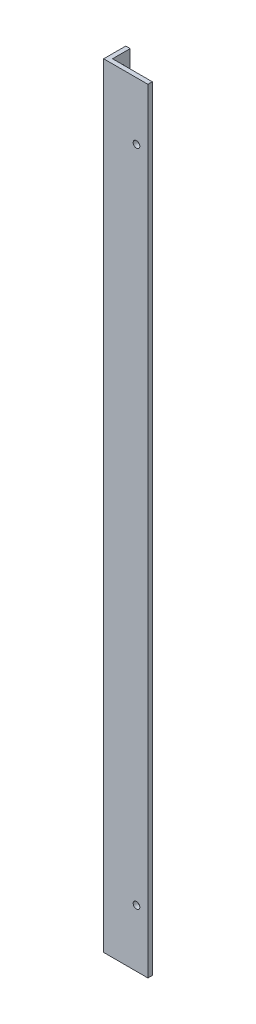
ISO-10303-21;
HEADER;
FILE_DESCRIPTION(('STEP AP214'),'2;1');
FILE_NAME('part.step','',(''),(''),'','','');
FILE_SCHEMA(('AUTOMOTIVE_DESIGN { 1 0 10303 214 1 1 1 1 }'));
ENDSEC;
DATA;
#1=APPLICATION_CONTEXT('core data for automotive mechanical design processes');
#2=APPLICATION_PROTOCOL_DEFINITION('international standard','automotive_design',2000,#1);
#3=PRODUCT_CONTEXT('',#1,'mechanical');
#4=PRODUCT('Part','Part','',(#3));
#5=PRODUCT_RELATED_PRODUCT_CATEGORY('part','',(#4));
#6=PRODUCT_DEFINITION_FORMATION('','',#4);
#7=PRODUCT_DEFINITION_CONTEXT('part definition',#1,'design');
#8=PRODUCT_DEFINITION('design','',#6,#7);
#9=PRODUCT_DEFINITION_SHAPE('','',#8);
#10=(LENGTH_UNIT() NAMED_UNIT(*) SI_UNIT(.MILLI.,.METRE.));
#11=(NAMED_UNIT(*) PLANE_ANGLE_UNIT() SI_UNIT($,.RADIAN.));
#12=(NAMED_UNIT(*) SI_UNIT($,.STERADIAN.) SOLID_ANGLE_UNIT());
#13=UNCERTAINTY_MEASURE_WITH_UNIT(LENGTH_MEASURE(1.E-05),#10,'distance_accuracy_value','');
#14=(GEOMETRIC_REPRESENTATION_CONTEXT(3) GLOBAL_UNCERTAINTY_ASSIGNED_CONTEXT((#13)) GLOBAL_UNIT_ASSIGNED_CONTEXT((#10,
#11,#12)) REPRESENTATION_CONTEXT('',''));
#15=CARTESIAN_POINT('',(0.,0.,0.));
#16=DIRECTION('',(0.,0.,1.));
#17=DIRECTION('',(1.,0.,0.));
#18=AXIS2_PLACEMENT_3D('',#15,#16,#17);
#19=CARTESIAN_POINT('',(0.,0.,0.));
#20=DIRECTION('',(0.,-1.,0.));
#21=DIRECTION('',(0.,0.,-1.));
#22=AXIS2_PLACEMENT_3D('',#19,#20,#21);
#23=PLANE('',#22);
#24=DIRECTION('',(1.,0.,0.));
#25=VECTOR('',#24,1.);
#26=CARTESIAN_POINT('',(20.,0.,0.));
#27=LINE('',#26,#25);
#28=CARTESIAN_POINT('',(0.,0.,0.));
#29=VERTEX_POINT('',#28);
#30=CARTESIAN_POINT('',(20.,0.,0.));
#31=VERTEX_POINT('',#30);
#32=EDGE_CURVE('E101',#29,#31,#27,.T.);
#33=ORIENTED_EDGE('',*,*,#32,.F.);
#34=DIRECTION('',(0.,0.,1.));
#35=VECTOR('',#34,1.);
#36=CARTESIAN_POINT('',(0.,0.,0.));
#37=LINE('',#36,#35);
#38=CARTESIAN_POINT('',(0.,0.,-10.));
#39=VERTEX_POINT('',#38);
#40=EDGE_CURVE('E123',#39,#29,#37,.T.);
#41=ORIENTED_EDGE('',*,*,#40,.F.);
#42=DIRECTION('',(-1.,0.,0.));
#43=VECTOR('',#42,1.);
#44=CARTESIAN_POINT('',(0.,0.,-10.));
#45=LINE('',#44,#43);
#46=CARTESIAN_POINT('',(2.,0.,-10.));
#47=VERTEX_POINT('',#46);
#48=EDGE_CURVE('E120',#47,#39,#45,.T.);
#49=ORIENTED_EDGE('',*,*,#48,.F.);
#50=DIRECTION('',(0.,0.,-1.));
#51=VECTOR('',#50,1.);
#52=CARTESIAN_POINT('',(2.,0.,-10.));
#53=LINE('',#52,#51);
#54=CARTESIAN_POINT('',(2.,0.,-2.));
#55=VERTEX_POINT('',#54);
#56=EDGE_CURVE('E117',#55,#47,#53,.T.);
#57=ORIENTED_EDGE('',*,*,#56,.F.);
#58=DIRECTION('',(-1.,0.,0.));
#59=VECTOR('',#58,1.);
#60=CARTESIAN_POINT('',(2.,0.,-2.));
#61=LINE('',#60,#59);
#62=CARTESIAN_POINT('',(20.,0.,-2.));
#63=VERTEX_POINT('',#62);
#64=EDGE_CURVE('E104',#63,#55,#61,.T.);
#65=ORIENTED_EDGE('',*,*,#64,.F.);
#66=DIRECTION('',(0.,0.,-1.));
#67=VECTOR('',#66,1.);
#68=CARTESIAN_POINT('',(20.,0.,-2.));
#69=LINE('',#68,#67);
#70=EDGE_CURVE('E91',#31,#63,#69,.T.);
#71=ORIENTED_EDGE('',*,*,#70,.F.);
#72=EDGE_LOOP('',(#33,#41,#49,#57,#65,#71));
#73=FACE_BOUND('',#72,.T.);
#74=ADVANCED_FACE('F35',(#73),#23,.T.);
#75=CARTESIAN_POINT('',(0.,372.360679774998,0.));
#76=DIRECTION('',(1.,0.,0.));
#77=DIRECTION('',(0.,0.,-1.));
#78=AXIS2_PLACEMENT_3D('',#75,#76,#77);
#79=PLANE('',#78);
#80=CARTESIAN_POINT('',(0.,6.00000000000001,-5.99999999999998));
#81=DIRECTION('',(-1.,0.,0.));
#82=DIRECTION('',(0.,0.,1.));
#83=AXIS2_PLACEMENT_3D('',#80,#81,#82);
#84=CIRCLE('',#83,1.49999999999999);
#85=CARTESIAN_POINT('',(0.,6.00000000000001,-4.49999999999999));
#86=VERTEX_POINT('',#85);
#87=EDGE_CURVE('E228',#86,#86,#84,.T.);
#88=ORIENTED_EDGE('',*,*,#87,.F.);
#89=EDGE_LOOP('',(#88));
#90=FACE_BOUND('',#89,.T.);
#91=CARTESIAN_POINT('',(0.,20.,-5.99999999999998));
#92=DIRECTION('',(-1.,0.,0.));
#93=DIRECTION('',(0.,0.,1.));
#94=AXIS2_PLACEMENT_3D('',#91,#92,#93);
#95=CIRCLE('',#94,1.49999999999999);
#96=CARTESIAN_POINT('',(0.,20.,-4.49999999999999));
#97=VERTEX_POINT('',#96);
#98=EDGE_CURVE('E232',#97,#97,#95,.T.);
#99=ORIENTED_EDGE('',*,*,#98,.F.);
#100=EDGE_LOOP('',(#99));
#101=FACE_BOUND('',#100,.T.);
#102=CARTESIAN_POINT('',(0.,330.,-5.99999999999998));
#103=DIRECTION('',(-1.,0.,0.));
#104=DIRECTION('',(0.,0.,1.));
#105=AXIS2_PLACEMENT_3D('',#102,#103,#104);
#106=CIRCLE('',#105,1.5);
#107=CARTESIAN_POINT('',(0.,330.,-4.49999999999998));
#108=VERTEX_POINT('',#107);
#109=EDGE_CURVE('E238',#108,#108,#106,.T.);
#110=ORIENTED_EDGE('',*,*,#109,.F.);
#111=EDGE_LOOP('',(#110));
#112=FACE_BOUND('',#111,.T.);
#113=CARTESIAN_POINT('',(0.,344.,-5.99999999999998));
#114=DIRECTION('',(-1.,0.,0.));
#115=DIRECTION('',(0.,0.,1.));
#116=AXIS2_PLACEMENT_3D('',#113,#114,#115);
#117=CIRCLE('',#116,1.5);
#118=CARTESIAN_POINT('',(0.,344.,-4.49999999999998));
#119=VERTEX_POINT('',#118);
#120=EDGE_CURVE('E148',#119,#119,#117,.T.);
#121=ORIENTED_EDGE('',*,*,#120,.F.);
#122=EDGE_LOOP('',(#121));
#123=FACE_BOUND('',#122,.T.);
#124=DIRECTION('',(0.,-1.,0.));
#125=VECTOR('',#124,1.);
#126=CARTESIAN_POINT('',(0.,372.360679774998,0.));
#127=LINE('',#126,#125);
#128=CARTESIAN_POINT('',(0.,350.,2.22044604925031E-13));
#129=VERTEX_POINT('',#128);
#130=EDGE_CURVE('E107',#129,#29,#127,.T.);
#131=ORIENTED_EDGE('',*,*,#130,.F.);
#132=DIRECTION('',(0.,0.,-1.));
#133=VECTOR('',#132,1.);
#134=CARTESIAN_POINT('',(0.,350.,0.));
#135=LINE('',#134,#133);
#136=CARTESIAN_POINT('',(0.,350.,-10.));
#137=VERTEX_POINT('',#136);
#138=EDGE_CURVE('E95',#129,#137,#135,.T.);
#139=ORIENTED_EDGE('',*,*,#138,.T.);
#140=DIRECTION('',(0.,-1.,0.));
#141=VECTOR('',#140,1.);
#142=CARTESIAN_POINT('',(0.,372.360679774998,-10.));
#143=LINE('',#142,#141);
#144=EDGE_CURVE('E126',#137,#39,#143,.T.);
#145=ORIENTED_EDGE('',*,*,#144,.T.);
#146=ORIENTED_EDGE('',*,*,#40,.T.);
#147=EDGE_LOOP('',(#131,#139,#145,#146));
#148=FACE_BOUND('',#147,.T.);
#149=ADVANCED_FACE('F168',(#90,#101,#112,#123,#148),#79,.F.);
#150=CARTESIAN_POINT('',(0.,372.360679774998,-10.));
#151=DIRECTION('',(0.,0.,1.));
#152=DIRECTION('',(1.,0.,0.));
#153=AXIS2_PLACEMENT_3D('',#150,#151,#152);
#154=PLANE('',#153);
#155=ORIENTED_EDGE('',*,*,#144,.F.);
#156=DIRECTION('',(1.,0.,0.));
#157=VECTOR('',#156,1.);
#158=CARTESIAN_POINT('',(0.,350.,-10.));
#159=LINE('',#158,#157);
#160=CARTESIAN_POINT('',(2.,350.,-10.));
#161=VERTEX_POINT('',#160);
#162=EDGE_CURVE('E134',#137,#161,#159,.T.);
#163=ORIENTED_EDGE('',*,*,#162,.T.);
#164=DIRECTION('',(0.,-1.,0.));
#165=VECTOR('',#164,1.);
#166=CARTESIAN_POINT('',(2.,372.360679774998,-10.));
#167=LINE('',#166,#165);
#168=EDGE_CURVE('E128',#161,#47,#167,.T.);
#169=ORIENTED_EDGE('',*,*,#168,.T.);
#170=ORIENTED_EDGE('',*,*,#48,.T.);
#171=EDGE_LOOP('',(#155,#163,#169,#170));
#172=FACE_BOUND('',#171,.T.);
#173=ADVANCED_FACE('F165',(#172),#154,.F.);
#174=CARTESIAN_POINT('',(2.,372.360679774998,-10.));
#175=DIRECTION('',(-1.,0.,0.));
#176=DIRECTION('',(0.,0.,1.));
#177=AXIS2_PLACEMENT_3D('',#174,#175,#176);
#178=PLANE('',#177);
#179=CARTESIAN_POINT('',(2.,6.00000000000001,-5.99999999999998));
#180=DIRECTION('',(-1.,0.,0.));
#181=DIRECTION('',(0.,0.,1.));
#182=AXIS2_PLACEMENT_3D('',#179,#180,#181);
#183=CIRCLE('',#182,1.49999999999999);
#184=CARTESIAN_POINT('',(2.,6.00000000000001,-4.49999999999998));
#185=VERTEX_POINT('',#184);
#186=EDGE_CURVE('E231',#185,#185,#183,.T.);
#187=ORIENTED_EDGE('',*,*,#186,.T.);
#188=EDGE_LOOP('',(#187));
#189=FACE_BOUND('',#188,.T.);
#190=CARTESIAN_POINT('',(2.,20.,-5.99999999999998));
#191=DIRECTION('',(-1.,0.,0.));
#192=DIRECTION('',(0.,0.,1.));
#193=AXIS2_PLACEMENT_3D('',#190,#191,#192);
#194=CIRCLE('',#193,1.49999999999999);
#195=CARTESIAN_POINT('',(2.,20.,-4.49999999999998));
#196=VERTEX_POINT('',#195);
#197=EDGE_CURVE('E39',#196,#196,#194,.T.);
#198=ORIENTED_EDGE('',*,*,#197,.T.);
#199=EDGE_LOOP('',(#198));
#200=FACE_BOUND('',#199,.T.);
#201=CARTESIAN_POINT('',(2.,330.,-5.99999999999998));
#202=DIRECTION('',(-1.,0.,0.));
#203=DIRECTION('',(0.,0.,1.));
#204=AXIS2_PLACEMENT_3D('',#201,#202,#203);
#205=CIRCLE('',#204,1.5);
#206=CARTESIAN_POINT('',(2.,330.,-4.49999999999998));
#207=VERTEX_POINT('',#206);
#208=EDGE_CURVE('E241',#207,#207,#205,.T.);
#209=ORIENTED_EDGE('',*,*,#208,.T.);
#210=EDGE_LOOP('',(#209));
#211=FACE_BOUND('',#210,.T.);
#212=CARTESIAN_POINT('',(2.,344.,-5.99999999999998));
#213=DIRECTION('',(-1.,0.,0.));
#214=DIRECTION('',(0.,0.,1.));
#215=AXIS2_PLACEMENT_3D('',#212,#213,#214);
#216=CIRCLE('',#215,1.5);
#217=CARTESIAN_POINT('',(2.,344.,-4.49999999999998));
#218=VERTEX_POINT('',#217);
#219=EDGE_CURVE('E143',#218,#218,#216,.T.);
#220=ORIENTED_EDGE('',*,*,#219,.T.);
#221=EDGE_LOOP('',(#220));
#222=FACE_BOUND('',#221,.T.);
#223=ORIENTED_EDGE('',*,*,#168,.F.);
#224=DIRECTION('',(0.,0.,1.));
#225=VECTOR('',#224,1.);
#226=CARTESIAN_POINT('',(2.,350.,-10.));
#227=LINE('',#226,#225);
#228=CARTESIAN_POINT('',(2.,350.,-2.));
#229=VERTEX_POINT('',#228);
#230=EDGE_CURVE('E154',#161,#229,#227,.T.);
#231=ORIENTED_EDGE('',*,*,#230,.T.);
#232=DIRECTION('',(0.,-1.,0.));
#233=VECTOR('',#232,1.);
#234=CARTESIAN_POINT('',(2.,372.360679774998,-2.));
#235=LINE('',#234,#233);
#236=EDGE_CURVE('E130',#229,#55,#235,.T.);
#237=ORIENTED_EDGE('',*,*,#236,.T.);
#238=ORIENTED_EDGE('',*,*,#56,.T.);
#239=EDGE_LOOP('',(#223,#231,#237,#238));
#240=FACE_BOUND('',#239,.T.);
#241=ADVANCED_FACE('F161',(#189,#200,#211,#222,#240),#178,.F.);
#242=CARTESIAN_POINT('',(2.,372.360679774998,-2.));
#243=DIRECTION('',(0.,0.,1.));
#244=DIRECTION('',(1.,0.,0.));
#245=AXIS2_PLACEMENT_3D('',#242,#243,#244);
#246=PLANE('',#245);
#247=CARTESIAN_POINT('',(14.8385011410141,25.9101040693963,-2.));
#248=DIRECTION('',(0.,0.,1.));
#249=DIRECTION('',(1.,0.,0.));
#250=AXIS2_PLACEMENT_3D('',#247,#248,#249);
#251=CIRCLE('',#250,1.49999999999999);
#252=CARTESIAN_POINT('',(16.3385011410141,25.9101040693963,-2.));
#253=VERTEX_POINT('',#252);
#254=EDGE_CURVE('E135',#253,#253,#251,.T.);
#255=ORIENTED_EDGE('',*,*,#254,.T.);
#256=EDGE_LOOP('',(#255));
#257=FACE_BOUND('',#256,.T.);
#258=CARTESIAN_POINT('',(14.8385011410141,323.866264902989,-2.));
#259=DIRECTION('',(0.,0.,1.));
#260=DIRECTION('',(1.,0.,0.));
#261=AXIS2_PLACEMENT_3D('',#258,#259,#260);
#262=CIRCLE('',#261,1.49999999999999);
#263=CARTESIAN_POINT('',(16.3385011410141,323.866264902989,-2.));
#264=VERTEX_POINT('',#263);
#265=EDGE_CURVE('E109',#264,#264,#262,.T.);
#266=ORIENTED_EDGE('',*,*,#265,.T.);
#267=EDGE_LOOP('',(#266));
#268=FACE_BOUND('',#267,.T.);
#269=ORIENTED_EDGE('',*,*,#236,.F.);
#270=DIRECTION('',(1.,0.,0.));
#271=VECTOR('',#270,1.);
#272=CARTESIAN_POINT('',(1.99999999999999,350.,-2.));
#273=LINE('',#272,#271);
#274=CARTESIAN_POINT('',(20.,350.,-2.));
#275=VERTEX_POINT('',#274);
#276=EDGE_CURVE('E56',#229,#275,#273,.T.);
#277=ORIENTED_EDGE('',*,*,#276,.T.);
#278=DIRECTION('',(0.,-1.,0.));
#279=VECTOR('',#278,1.);
#280=CARTESIAN_POINT('',(20.,372.360679774998,-2.));
#281=LINE('',#280,#279);
#282=EDGE_CURVE('E96',#275,#63,#281,.T.);
#283=ORIENTED_EDGE('',*,*,#282,.T.);
#284=ORIENTED_EDGE('',*,*,#64,.T.);
#285=EDGE_LOOP('',(#269,#277,#283,#284));
#286=FACE_BOUND('',#285,.T.);
#287=ADVANCED_FACE('F158',(#257,#268,#286),#246,.F.);
#288=CARTESIAN_POINT('',(20.,372.360679774998,-2.));
#289=DIRECTION('',(-1.,0.,0.));
#290=DIRECTION('',(0.,0.,1.));
#291=AXIS2_PLACEMENT_3D('',#288,#289,#290);
#292=PLANE('',#291);
#293=ORIENTED_EDGE('',*,*,#282,.F.);
#294=DIRECTION('',(0.,0.,1.));
#295=VECTOR('',#294,1.);
#296=CARTESIAN_POINT('',(20.,350.,-2.));
#297=LINE('',#296,#295);
#298=CARTESIAN_POINT('',(20.,350.,0.));
#299=VERTEX_POINT('',#298);
#300=EDGE_CURVE('E44',#275,#299,#297,.T.);
#301=ORIENTED_EDGE('',*,*,#300,.T.);
#302=DIRECTION('',(0.,-1.,0.));
#303=VECTOR('',#302,1.);
#304=CARTESIAN_POINT('',(20.,372.360679774998,0.));
#305=LINE('',#304,#303);
#306=EDGE_CURVE('E88',#299,#31,#305,.T.);
#307=ORIENTED_EDGE('',*,*,#306,.T.);
#308=ORIENTED_EDGE('',*,*,#70,.T.);
#309=EDGE_LOOP('',(#293,#301,#307,#308));
#310=FACE_BOUND('',#309,.T.);
#311=ADVANCED_FACE('F90',(#310),#292,.F.);
#312=CARTESIAN_POINT('',(20.,372.360679774998,0.));
#313=DIRECTION('',(0.,0.,-1.));
#314=DIRECTION('',(-1.,0.,0.));
#315=AXIS2_PLACEMENT_3D('',#312,#313,#314);
#316=PLANE('',#315);
#317=CARTESIAN_POINT('',(14.8385011410141,25.9101040693963,0.));
#318=DIRECTION('',(0.,0.,1.));
#319=DIRECTION('',(1.,0.,0.));
#320=AXIS2_PLACEMENT_3D('',#317,#318,#319);
#321=CIRCLE('',#320,1.49999999999999);
#322=CARTESIAN_POINT('',(16.3385011410141,25.9101040693963,0.));
#323=VERTEX_POINT('',#322);
#324=EDGE_CURVE('E137',#323,#323,#321,.T.);
#325=ORIENTED_EDGE('',*,*,#324,.F.);
#326=EDGE_LOOP('',(#325));
#327=FACE_BOUND('',#326,.T.);
#328=CARTESIAN_POINT('',(14.8385011410141,323.866264902989,0.));
#329=DIRECTION('',(0.,0.,1.));
#330=DIRECTION('',(1.,0.,0.));
#331=AXIS2_PLACEMENT_3D('',#328,#329,#330);
#332=CIRCLE('',#331,1.49999999999999);
#333=CARTESIAN_POINT('',(16.3385011410141,323.866264902989,0.));
#334=VERTEX_POINT('',#333);
#335=EDGE_CURVE('E112',#334,#334,#332,.T.);
#336=ORIENTED_EDGE('',*,*,#335,.F.);
#337=EDGE_LOOP('',(#336));
#338=FACE_BOUND('',#337,.T.);
#339=ORIENTED_EDGE('',*,*,#306,.F.);
#340=DIRECTION('',(-1.,0.,0.));
#341=VECTOR('',#340,1.);
#342=CARTESIAN_POINT('',(20.,350.,0.));
#343=LINE('',#342,#341);
#344=EDGE_CURVE('E11',#299,#129,#343,.T.);
#345=ORIENTED_EDGE('',*,*,#344,.T.);
#346=ORIENTED_EDGE('',*,*,#130,.T.);
#347=ORIENTED_EDGE('',*,*,#32,.T.);
#348=EDGE_LOOP('',(#339,#345,#346,#347));
#349=FACE_BOUND('',#348,.T.);
#350=ADVANCED_FACE('F37',(#327,#338,#349),#316,.F.);
#351=CARTESIAN_POINT('',(28.0000000000001,350.,-417.999999999758));
#352=DIRECTION('',(0.,-1.,0.));
#353=DIRECTION('',(1.,0.,0.));
#354=AXIS2_PLACEMENT_3D('',#351,#352,#353);
#355=PLANE('',#354);
#356=ORIENTED_EDGE('',*,*,#300,.F.);
#357=ORIENTED_EDGE('',*,*,#276,.F.);
#358=ORIENTED_EDGE('',*,*,#230,.F.);
#359=ORIENTED_EDGE('',*,*,#162,.F.);
#360=ORIENTED_EDGE('',*,*,#138,.F.);
#361=ORIENTED_EDGE('',*,*,#344,.F.);
#362=EDGE_LOOP('',(#356,#357,#358,#359,#360,#361));
#363=FACE_BOUND('',#362,.T.);
#364=ADVANCED_FACE('F162',(#363),#355,.F.);
#365=CARTESIAN_POINT('',(14.8385011410141,323.866264902989,0.));
#366=DIRECTION('',(0.,0.,1.));
#367=DIRECTION('',(1.,0.,0.));
#368=AXIS2_PLACEMENT_3D('',#365,#366,#367);
#369=CYLINDRICAL_SURFACE('',#368,1.49999999999999);
#370=ORIENTED_EDGE('',*,*,#335,.T.);
#371=EDGE_LOOP('',(#370));
#372=FACE_BOUND('',#371,.T.);
#373=ORIENTED_EDGE('',*,*,#265,.F.);
#374=EDGE_LOOP('',(#373));
#375=FACE_BOUND('',#374,.T.);
#376=ADVANCED_FACE('F195',(#372,#375),#369,.F.);
#377=CARTESIAN_POINT('',(14.8385011410141,25.9101040693963,0.));
#378=DIRECTION('',(0.,0.,1.));
#379=DIRECTION('',(1.,0.,0.));
#380=AXIS2_PLACEMENT_3D('',#377,#378,#379);
#381=CYLINDRICAL_SURFACE('',#380,1.49999999999999);
#382=ORIENTED_EDGE('',*,*,#324,.T.);
#383=EDGE_LOOP('',(#382));
#384=FACE_BOUND('',#383,.T.);
#385=ORIENTED_EDGE('',*,*,#254,.F.);
#386=EDGE_LOOP('',(#385));
#387=FACE_BOUND('',#386,.T.);
#388=ADVANCED_FACE('F200',(#384,#387),#381,.F.);
#389=CARTESIAN_POINT('',(0.,344.,-5.99999999999998));
#390=DIRECTION('',(-1.,0.,0.));
#391=DIRECTION('',(0.,0.,1.));
#392=AXIS2_PLACEMENT_3D('',#389,#390,#391);
#393=CYLINDRICAL_SURFACE('',#392,1.5);
#394=ORIENTED_EDGE('',*,*,#120,.T.);
#395=EDGE_LOOP('',(#394));
#396=FACE_BOUND('',#395,.T.);
#397=ORIENTED_EDGE('',*,*,#219,.F.);
#398=EDGE_LOOP('',(#397));
#399=FACE_BOUND('',#398,.T.);
#400=ADVANCED_FACE('F207',(#396,#399),#393,.F.);
#401=CARTESIAN_POINT('',(0.,330.,-5.99999999999998));
#402=DIRECTION('',(-1.,0.,0.));
#403=DIRECTION('',(0.,0.,1.));
#404=AXIS2_PLACEMENT_3D('',#401,#402,#403);
#405=CYLINDRICAL_SURFACE('',#404,1.5);
#406=ORIENTED_EDGE('',*,*,#109,.T.);
#407=EDGE_LOOP('',(#406));
#408=FACE_BOUND('',#407,.T.);
#409=ORIENTED_EDGE('',*,*,#208,.F.);
#410=EDGE_LOOP('',(#409));
#411=FACE_BOUND('',#410,.T.);
#412=ADVANCED_FACE('F212',(#408,#411),#405,.F.);
#413=CARTESIAN_POINT('',(0.,20.,-5.99999999999998));
#414=DIRECTION('',(-1.,0.,0.));
#415=DIRECTION('',(0.,0.,1.));
#416=AXIS2_PLACEMENT_3D('',#413,#414,#415);
#417=CYLINDRICAL_SURFACE('',#416,1.49999999999999);
#418=ORIENTED_EDGE('',*,*,#98,.T.);
#419=EDGE_LOOP('',(#418));
#420=FACE_BOUND('',#419,.T.);
#421=ORIENTED_EDGE('',*,*,#197,.F.);
#422=EDGE_LOOP('',(#421));
#423=FACE_BOUND('',#422,.T.);
#424=ADVANCED_FACE('F216',(#420,#423),#417,.F.);
#425=CARTESIAN_POINT('',(0.,6.00000000000001,-5.99999999999998));
#426=DIRECTION('',(-1.,0.,0.));
#427=DIRECTION('',(0.,0.,1.));
#428=AXIS2_PLACEMENT_3D('',#425,#426,#427);
#429=CYLINDRICAL_SURFACE('',#428,1.49999999999999);
#430=ORIENTED_EDGE('',*,*,#87,.T.);
#431=EDGE_LOOP('',(#430));
#432=FACE_BOUND('',#431,.T.);
#433=ORIENTED_EDGE('',*,*,#186,.F.);
#434=EDGE_LOOP('',(#433));
#435=FACE_BOUND('',#434,.T.);
#436=ADVANCED_FACE('F220',(#432,#435),#429,.F.);
#437=CLOSED_SHELL('',(#74,#149,#173,#241,#287,#311,#350,#364,#376,#388,#400,#412,#424,#436));
#438=MANIFOLD_SOLID_BREP('B2',#437);
#439=ADVANCED_BREP_SHAPE_REPRESENTATION('',(#18,#438),#14);
#440=SHAPE_DEFINITION_REPRESENTATION(#9,#439);
ENDSEC;
END-ISO-10303-21;
